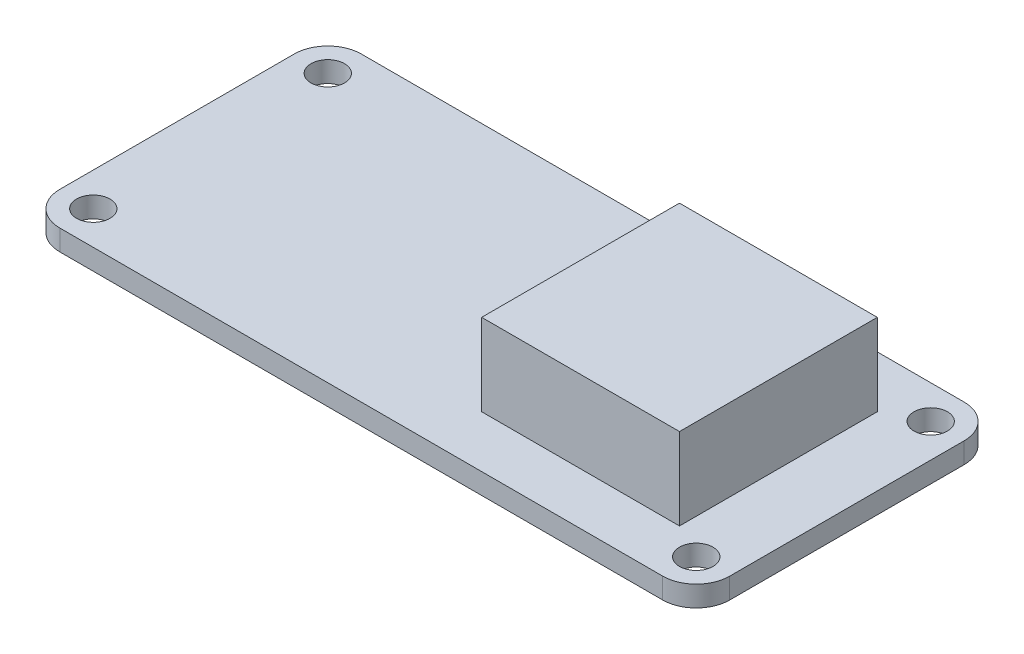
ISO-10303-21;
HEADER;
FILE_DESCRIPTION(('STEP AP214'),'2;1');
FILE_NAME('part.step','',(''),(''),'','','');
FILE_SCHEMA(('AUTOMOTIVE_DESIGN { 1 0 10303 214 1 1 1 1 }'));
ENDSEC;
DATA;
#1=APPLICATION_CONTEXT('core data for automotive mechanical design processes');
#2=APPLICATION_PROTOCOL_DEFINITION('international standard','automotive_design',2000,#1);
#3=PRODUCT_CONTEXT('',#1,'mechanical');
#4=PRODUCT('Part','Part','',(#3));
#5=PRODUCT_RELATED_PRODUCT_CATEGORY('part','',(#4));
#6=PRODUCT_DEFINITION_FORMATION('','',#4);
#7=PRODUCT_DEFINITION_CONTEXT('part definition',#1,'design');
#8=PRODUCT_DEFINITION('design','',#6,#7);
#9=PRODUCT_DEFINITION_SHAPE('','',#8);
#10=(LENGTH_UNIT() NAMED_UNIT(*) SI_UNIT(.MILLI.,.METRE.));
#11=(NAMED_UNIT(*) PLANE_ANGLE_UNIT() SI_UNIT($,.RADIAN.));
#12=(NAMED_UNIT(*) SI_UNIT($,.STERADIAN.) SOLID_ANGLE_UNIT());
#13=UNCERTAINTY_MEASURE_WITH_UNIT(LENGTH_MEASURE(1.E-05),#10,'distance_accuracy_value','');
#14=(GEOMETRIC_REPRESENTATION_CONTEXT(3) GLOBAL_UNCERTAINTY_ASSIGNED_CONTEXT((#13)) GLOBAL_UNIT_ASSIGNED_CONTEXT((#10,
#11,#12)) REPRESENTATION_CONTEXT('',''));
#15=CARTESIAN_POINT('',(0.,0.,0.));
#16=DIRECTION('',(0.,0.,1.));
#17=DIRECTION('',(1.,0.,0.));
#18=AXIS2_PLACEMENT_3D('',#15,#16,#17);
#19=CARTESIAN_POINT('',(0.,1.57,0.));
#20=DIRECTION('',(0.,-1.,0.));
#21=DIRECTION('',(0.,0.,-1.));
#22=AXIS2_PLACEMENT_3D('',#19,#20,#21);
#23=PLANE('',#22);
#24=DIRECTION('',(0.,0.,-1.));
#25=VECTOR('',#24,1.);
#26=CARTESIAN_POINT('',(25.4,1.57,11.43));
#27=LINE('',#26,#25);
#28=CARTESIAN_POINT('',(25.4,1.57,8.89));
#29=VERTEX_POINT('',#28);
#30=CARTESIAN_POINT('',(25.4,1.57,-8.89));
#31=VERTEX_POINT('',#30);
#32=EDGE_CURVE('E176',#29,#31,#27,.T.);
#33=ORIENTED_EDGE('',*,*,#32,.T.);
#34=CARTESIAN_POINT('',(22.86,1.57,-8.89));
#35=DIRECTION('',(0.,-1.,0.));
#36=DIRECTION('',(0.,0.,-1.));
#37=AXIS2_PLACEMENT_3D('',#34,#35,#36);
#38=CIRCLE('',#37,2.54);
#39=CARTESIAN_POINT('',(22.86,1.57,-11.43));
#40=VERTEX_POINT('',#39);
#41=EDGE_CURVE('E223',#31,#40,#38,.F.);
#42=ORIENTED_EDGE('',*,*,#41,.T.);
#43=DIRECTION('',(-1.,0.,0.));
#44=VECTOR('',#43,1.);
#45=CARTESIAN_POINT('',(-25.4,1.57,-11.43));
#46=LINE('',#45,#44);
#47=CARTESIAN_POINT('',(-22.86,1.57,-11.43));
#48=VERTEX_POINT('',#47);
#49=EDGE_CURVE('E179',#40,#48,#46,.T.);
#50=ORIENTED_EDGE('',*,*,#49,.T.);
#51=CARTESIAN_POINT('',(-22.86,1.57,-8.89));
#52=DIRECTION('',(0.,-1.,0.));
#53=DIRECTION('',(0.,0.,-1.));
#54=AXIS2_PLACEMENT_3D('',#51,#52,#53);
#55=CIRCLE('',#54,2.54);
#56=CARTESIAN_POINT('',(-25.4,1.57,-8.89));
#57=VERTEX_POINT('',#56);
#58=EDGE_CURVE('E217',#48,#57,#55,.F.);
#59=ORIENTED_EDGE('',*,*,#58,.T.);
#60=DIRECTION('',(0.,0.,1.));
#61=VECTOR('',#60,1.);
#62=CARTESIAN_POINT('',(-25.4,1.57,11.43));
#63=LINE('',#62,#61);
#64=CARTESIAN_POINT('',(-25.4,1.57,8.89));
#65=VERTEX_POINT('',#64);
#66=EDGE_CURVE('E183',#57,#65,#63,.T.);
#67=ORIENTED_EDGE('',*,*,#66,.T.);
#68=CARTESIAN_POINT('',(-22.86,1.57,8.89));
#69=DIRECTION('',(0.,-1.,0.));
#70=DIRECTION('',(0.,0.,-1.));
#71=AXIS2_PLACEMENT_3D('',#68,#69,#70);
#72=CIRCLE('',#71,2.54);
#73=CARTESIAN_POINT('',(-22.86,1.57,11.43));
#74=VERTEX_POINT('',#73);
#75=EDGE_CURVE('E219',#65,#74,#72,.F.);
#76=ORIENTED_EDGE('',*,*,#75,.T.);
#77=DIRECTION('',(1.,0.,0.));
#78=VECTOR('',#77,1.);
#79=CARTESIAN_POINT('',(-25.4,1.57,11.43));
#80=LINE('',#79,#78);
#81=CARTESIAN_POINT('',(22.86,1.57,11.43));
#82=VERTEX_POINT('',#81);
#83=EDGE_CURVE('E186',#74,#82,#80,.T.);
#84=ORIENTED_EDGE('',*,*,#83,.T.);
#85=CARTESIAN_POINT('',(22.86,1.57,8.89));
#86=DIRECTION('',(0.,-1.,0.));
#87=DIRECTION('',(0.,0.,-1.));
#88=AXIS2_PLACEMENT_3D('',#85,#86,#87);
#89=CIRCLE('',#88,2.54);
#90=EDGE_CURVE('E221',#82,#29,#89,.F.);
#91=ORIENTED_EDGE('',*,*,#90,.T.);
#92=EDGE_LOOP('',(#33,#42,#50,#59,#67,#76,#84,#91));
#93=FACE_BOUND('',#92,.T.);
#94=CARTESIAN_POINT('',(-22.86,1.57,8.89));
#95=DIRECTION('',(0.,1.,0.));
#96=DIRECTION('',(0.,0.,1.));
#97=AXIS2_PLACEMENT_3D('',#94,#95,#96);
#98=CIRCLE('',#97,1.26999999999999);
#99=CARTESIAN_POINT('',(-22.86,1.57,10.16));
#100=VERTEX_POINT('',#99);
#101=EDGE_CURVE('E169',#100,#100,#98,.T.);
#102=ORIENTED_EDGE('',*,*,#101,.F.);
#103=EDGE_LOOP('',(#102));
#104=FACE_BOUND('',#103,.T.);
#105=CARTESIAN_POINT('',(22.86,1.57,8.89));
#106=DIRECTION('',(0.,1.,0.));
#107=DIRECTION('',(0.,0.,1.));
#108=AXIS2_PLACEMENT_3D('',#105,#106,#107);
#109=CIRCLE('',#108,1.26999999999999);
#110=CARTESIAN_POINT('',(22.86,1.57,10.16));
#111=VERTEX_POINT('',#110);
#112=EDGE_CURVE('E163',#111,#111,#109,.T.);
#113=ORIENTED_EDGE('',*,*,#112,.F.);
#114=EDGE_LOOP('',(#113));
#115=FACE_BOUND('',#114,.T.);
#116=CARTESIAN_POINT('',(22.86,1.57,-8.89));
#117=DIRECTION('',(0.,1.,0.));
#118=DIRECTION('',(0.,0.,1.));
#119=AXIS2_PLACEMENT_3D('',#116,#117,#118);
#120=CIRCLE('',#119,1.26999999999999);
#121=CARTESIAN_POINT('',(22.86,1.57,-7.62000000000001));
#122=VERTEX_POINT('',#121);
#123=EDGE_CURVE('E157',#122,#122,#120,.T.);
#124=ORIENTED_EDGE('',*,*,#123,.F.);
#125=EDGE_LOOP('',(#124));
#126=FACE_BOUND('',#125,.T.);
#127=CARTESIAN_POINT('',(-22.86,1.57,-8.89));
#128=DIRECTION('',(0.,1.,0.));
#129=DIRECTION('',(0.,0.,1.));
#130=AXIS2_PLACEMENT_3D('',#127,#128,#129);
#131=CIRCLE('',#130,1.26999999999999);
#132=CARTESIAN_POINT('',(-22.86,1.57,-7.62000000000001));
#133=VERTEX_POINT('',#132);
#134=EDGE_CURVE('E146',#133,#133,#131,.T.);
#135=ORIENTED_EDGE('',*,*,#134,.F.);
#136=EDGE_LOOP('',(#135));
#137=FACE_BOUND('',#136,.T.);
#138=DIRECTION('',(0.,0.,-1.));
#139=VECTOR('',#138,1.);
#140=CARTESIAN_POINT('',(20.2,1.57,7.5));
#141=LINE('',#140,#139);
#142=CARTESIAN_POINT('',(20.2,1.57,7.5));
#143=VERTEX_POINT('',#142);
#144=CARTESIAN_POINT('',(20.2,1.57,-7.5));
#145=VERTEX_POINT('',#144);
#146=EDGE_CURVE('E145',#143,#145,#141,.T.);
#147=ORIENTED_EDGE('',*,*,#146,.F.);
#148=DIRECTION('',(1.,0.,0.));
#149=VECTOR('',#148,1.);
#150=CARTESIAN_POINT('',(5.20000000000001,1.57,7.5));
#151=LINE('',#150,#149);
#152=CARTESIAN_POINT('',(5.20000000000001,1.57,7.5));
#153=VERTEX_POINT('',#152);
#154=EDGE_CURVE('E142',#153,#143,#151,.T.);
#155=ORIENTED_EDGE('',*,*,#154,.F.);
#156=DIRECTION('',(0.,0.,1.));
#157=VECTOR('',#156,1.);
#158=CARTESIAN_POINT('',(5.20000000000001,1.57,7.5));
#159=LINE('',#158,#157);
#160=CARTESIAN_POINT('',(5.20000000000001,1.57,-7.5));
#161=VERTEX_POINT('',#160);
#162=EDGE_CURVE('E57',#161,#153,#159,.T.);
#163=ORIENTED_EDGE('',*,*,#162,.F.);
#164=DIRECTION('',(-1.,0.,0.));
#165=VECTOR('',#164,1.);
#166=CARTESIAN_POINT('',(5.20000000000001,1.57,-7.5));
#167=LINE('',#166,#165);
#168=EDGE_CURVE('E52',#145,#161,#167,.T.);
#169=ORIENTED_EDGE('',*,*,#168,.F.);
#170=EDGE_LOOP('',(#147,#155,#163,#169));
#171=FACE_BOUND('',#170,.T.);
#172=ADVANCED_FACE('F37',(#93,#104,#115,#126,#137,#171),#23,.F.);
#173=CARTESIAN_POINT('',(25.4,1.57,11.43));
#174=DIRECTION('',(-1.,0.,0.));
#175=DIRECTION('',(0.,0.,1.));
#176=AXIS2_PLACEMENT_3D('',#173,#174,#175);
#177=PLANE('',#176);
#178=DIRECTION('',(0.,0.,-1.));
#179=VECTOR('',#178,1.);
#180=CARTESIAN_POINT('',(25.4,0.,11.43));
#181=LINE('',#180,#179);
#182=CARTESIAN_POINT('',(25.4,0.,8.89));
#183=VERTEX_POINT('',#182);
#184=CARTESIAN_POINT('',(25.4,0.,-8.89));
#185=VERTEX_POINT('',#184);
#186=EDGE_CURVE('E175',#183,#185,#181,.T.);
#187=ORIENTED_EDGE('',*,*,#186,.T.);
#188=DIRECTION('',(0.,-1.,0.));
#189=VECTOR('',#188,1.);
#190=CARTESIAN_POINT('',(25.4,1.57,-8.89));
#191=LINE('',#190,#189);
#192=EDGE_CURVE('E215',#185,#31,#191,.F.);
#193=ORIENTED_EDGE('',*,*,#192,.T.);
#194=ORIENTED_EDGE('',*,*,#32,.F.);
#195=DIRECTION('',(0.,-1.,0.));
#196=VECTOR('',#195,1.);
#197=CARTESIAN_POINT('',(25.4,1.57,8.89));
#198=LINE('',#197,#196);
#199=EDGE_CURVE('E212',#29,#183,#198,.T.);
#200=ORIENTED_EDGE('',*,*,#199,.T.);
#201=EDGE_LOOP('',(#187,#193,#194,#200));
#202=FACE_BOUND('',#201,.T.);
#203=ADVANCED_FACE('F259',(#202),#177,.F.);
#204=CARTESIAN_POINT('',(-25.4,1.57,-11.43));
#205=DIRECTION('',(0.,0.,1.));
#206=DIRECTION('',(1.,0.,0.));
#207=AXIS2_PLACEMENT_3D('',#204,#205,#206);
#208=PLANE('',#207);
#209=ORIENTED_EDGE('',*,*,#49,.F.);
#210=DIRECTION('',(0.,-1.,0.));
#211=VECTOR('',#210,1.);
#212=CARTESIAN_POINT('',(22.86,1.57,-11.43));
#213=LINE('',#212,#211);
#214=CARTESIAN_POINT('',(22.86,0.,-11.43));
#215=VERTEX_POINT('',#214);
#216=EDGE_CURVE('E201',#40,#215,#213,.T.);
#217=ORIENTED_EDGE('',*,*,#216,.T.);
#218=DIRECTION('',(-1.,0.,0.));
#219=VECTOR('',#218,1.);
#220=CARTESIAN_POINT('',(-25.4,0.,-11.43));
#221=LINE('',#220,#219);
#222=CARTESIAN_POINT('',(-22.86,0.,-11.43));
#223=VERTEX_POINT('',#222);
#224=EDGE_CURVE('E192',#215,#223,#221,.T.);
#225=ORIENTED_EDGE('',*,*,#224,.T.);
#226=DIRECTION('',(0.,-1.,0.));
#227=VECTOR('',#226,1.);
#228=CARTESIAN_POINT('',(-22.86,1.57,-11.43));
#229=LINE('',#228,#227);
#230=EDGE_CURVE('E189',#223,#48,#229,.F.);
#231=ORIENTED_EDGE('',*,*,#230,.T.);
#232=EDGE_LOOP('',(#209,#217,#225,#231));
#233=FACE_BOUND('',#232,.T.);
#234=ADVANCED_FACE('F267',(#233),#208,.F.);
#235=CARTESIAN_POINT('',(-25.4,1.57,11.43));
#236=DIRECTION('',(1.,0.,0.));
#237=DIRECTION('',(0.,0.,-1.));
#238=AXIS2_PLACEMENT_3D('',#235,#236,#237);
#239=PLANE('',#238);
#240=DIRECTION('',(0.,0.,1.));
#241=VECTOR('',#240,1.);
#242=CARTESIAN_POINT('',(-25.4,0.,11.43));
#243=LINE('',#242,#241);
#244=CARTESIAN_POINT('',(-25.4,0.,-8.89));
#245=VERTEX_POINT('',#244);
#246=CARTESIAN_POINT('',(-25.4,0.,8.89));
#247=VERTEX_POINT('',#246);
#248=EDGE_CURVE('E195',#245,#247,#243,.T.);
#249=ORIENTED_EDGE('',*,*,#248,.T.);
#250=DIRECTION('',(0.,-1.,0.));
#251=VECTOR('',#250,1.);
#252=CARTESIAN_POINT('',(-25.4,1.57,8.89));
#253=LINE('',#252,#251);
#254=EDGE_CURVE('E11',#247,#65,#253,.F.);
#255=ORIENTED_EDGE('',*,*,#254,.T.);
#256=ORIENTED_EDGE('',*,*,#66,.F.);
#257=DIRECTION('',(0.,-1.,0.));
#258=VECTOR('',#257,1.);
#259=CARTESIAN_POINT('',(-25.4,1.57,-8.89));
#260=LINE('',#259,#258);
#261=EDGE_CURVE('E45',#57,#245,#260,.T.);
#262=ORIENTED_EDGE('',*,*,#261,.T.);
#263=EDGE_LOOP('',(#249,#255,#256,#262));
#264=FACE_BOUND('',#263,.T.);
#265=ADVANCED_FACE('F234',(#264),#239,.F.);
#266=CARTESIAN_POINT('',(-25.4,1.57,11.43));
#267=DIRECTION('',(0.,0.,-1.));
#268=DIRECTION('',(-1.,0.,0.));
#269=AXIS2_PLACEMENT_3D('',#266,#267,#268);
#270=PLANE('',#269);
#271=DIRECTION('',(1.,0.,0.));
#272=VECTOR('',#271,1.);
#273=CARTESIAN_POINT('',(-25.4,0.,11.43));
#274=LINE('',#273,#272);
#275=CARTESIAN_POINT('',(-22.86,0.,11.43));
#276=VERTEX_POINT('',#275);
#277=CARTESIAN_POINT('',(22.86,0.,11.43));
#278=VERTEX_POINT('',#277);
#279=EDGE_CURVE('E180',#276,#278,#274,.T.);
#280=ORIENTED_EDGE('',*,*,#279,.T.);
#281=DIRECTION('',(0.,-1.,0.));
#282=VECTOR('',#281,1.);
#283=CARTESIAN_POINT('',(22.86,1.57,11.43));
#284=LINE('',#283,#282);
#285=EDGE_CURVE('E228',#278,#82,#284,.F.);
#286=ORIENTED_EDGE('',*,*,#285,.T.);
#287=ORIENTED_EDGE('',*,*,#83,.F.);
#288=DIRECTION('',(0.,-1.,0.));
#289=VECTOR('',#288,1.);
#290=CARTESIAN_POINT('',(-22.86,1.57,11.43));
#291=LINE('',#290,#289);
#292=EDGE_CURVE('E225',#74,#276,#291,.T.);
#293=ORIENTED_EDGE('',*,*,#292,.T.);
#294=EDGE_LOOP('',(#280,#286,#287,#293));
#295=FACE_BOUND('',#294,.T.);
#296=ADVANCED_FACE('F248',(#295),#270,.F.);
#297=CARTESIAN_POINT('',(0.,0.,0.));
#298=DIRECTION('',(0.,-1.,0.));
#299=DIRECTION('',(0.,0.,-1.));
#300=AXIS2_PLACEMENT_3D('',#297,#298,#299);
#301=PLANE('',#300);
#302=CARTESIAN_POINT('',(-22.86,0.,-8.89));
#303=DIRECTION('',(0.,1.,0.));
#304=DIRECTION('',(0.,0.,1.));
#305=AXIS2_PLACEMENT_3D('',#302,#303,#304);
#306=CIRCLE('',#305,1.27);
#307=CARTESIAN_POINT('',(-22.86,0.,-7.62));
#308=VERTEX_POINT('',#307);
#309=EDGE_CURVE('E149',#308,#308,#306,.T.);
#310=ORIENTED_EDGE('',*,*,#309,.T.);
#311=EDGE_LOOP('',(#310));
#312=FACE_BOUND('',#311,.T.);
#313=CARTESIAN_POINT('',(22.86,0.,-8.89));
#314=DIRECTION('',(0.,1.,0.));
#315=DIRECTION('',(0.,0.,1.));
#316=AXIS2_PLACEMENT_3D('',#313,#314,#315);
#317=CIRCLE('',#316,1.27);
#318=CARTESIAN_POINT('',(22.86,0.,-7.62));
#319=VERTEX_POINT('',#318);
#320=EDGE_CURVE('E160',#319,#319,#317,.T.);
#321=ORIENTED_EDGE('',*,*,#320,.T.);
#322=EDGE_LOOP('',(#321));
#323=FACE_BOUND('',#322,.T.);
#324=CARTESIAN_POINT('',(22.86,0.,8.89));
#325=DIRECTION('',(0.,1.,0.));
#326=DIRECTION('',(0.,0.,1.));
#327=AXIS2_PLACEMENT_3D('',#324,#325,#326);
#328=CIRCLE('',#327,1.27);
#329=CARTESIAN_POINT('',(22.86,0.,10.16));
#330=VERTEX_POINT('',#329);
#331=EDGE_CURVE('E166',#330,#330,#328,.T.);
#332=ORIENTED_EDGE('',*,*,#331,.T.);
#333=EDGE_LOOP('',(#332));
#334=FACE_BOUND('',#333,.T.);
#335=CARTESIAN_POINT('',(-22.86,0.,8.89));
#336=DIRECTION('',(0.,1.,0.));
#337=DIRECTION('',(0.,0.,1.));
#338=AXIS2_PLACEMENT_3D('',#335,#336,#337);
#339=CIRCLE('',#338,1.27);
#340=CARTESIAN_POINT('',(-22.86,0.,10.16));
#341=VERTEX_POINT('',#340);
#342=EDGE_CURVE('E172',#341,#341,#339,.T.);
#343=ORIENTED_EDGE('',*,*,#342,.T.);
#344=EDGE_LOOP('',(#343));
#345=FACE_BOUND('',#344,.T.);
#346=ORIENTED_EDGE('',*,*,#224,.F.);
#347=CARTESIAN_POINT('',(22.86,0.,-8.89));
#348=DIRECTION('',(0.,-1.,0.));
#349=DIRECTION('',(0.,0.,-1.));
#350=AXIS2_PLACEMENT_3D('',#347,#348,#349);
#351=CIRCLE('',#350,2.54);
#352=EDGE_CURVE('E210',#215,#185,#351,.T.);
#353=ORIENTED_EDGE('',*,*,#352,.T.);
#354=ORIENTED_EDGE('',*,*,#186,.F.);
#355=CARTESIAN_POINT('',(22.86,0.,8.89));
#356=DIRECTION('',(0.,-1.,0.));
#357=DIRECTION('',(0.,0.,-1.));
#358=AXIS2_PLACEMENT_3D('',#355,#356,#357);
#359=CIRCLE('',#358,2.54);
#360=EDGE_CURVE('E208',#183,#278,#359,.T.);
#361=ORIENTED_EDGE('',*,*,#360,.T.);
#362=ORIENTED_EDGE('',*,*,#279,.F.);
#363=CARTESIAN_POINT('',(-22.86,0.,8.89));
#364=DIRECTION('',(0.,-1.,0.));
#365=DIRECTION('',(0.,0.,-1.));
#366=AXIS2_PLACEMENT_3D('',#363,#364,#365);
#367=CIRCLE('',#366,2.54);
#368=EDGE_CURVE('E206',#276,#247,#367,.T.);
#369=ORIENTED_EDGE('',*,*,#368,.T.);
#370=ORIENTED_EDGE('',*,*,#248,.F.);
#371=CARTESIAN_POINT('',(-22.86,0.,-8.89));
#372=DIRECTION('',(0.,-1.,0.));
#373=DIRECTION('',(0.,0.,-1.));
#374=AXIS2_PLACEMENT_3D('',#371,#372,#373);
#375=CIRCLE('',#374,2.54);
#376=EDGE_CURVE('E204',#245,#223,#375,.T.);
#377=ORIENTED_EDGE('',*,*,#376,.T.);
#378=EDGE_LOOP('',(#346,#353,#354,#361,#362,#369,#370,#377));
#379=FACE_BOUND('',#378,.T.);
#380=ADVANCED_FACE('F240',(#312,#323,#334,#345,#379),#301,.T.);
#381=CARTESIAN_POINT('',(-22.86,1.57,8.89));
#382=DIRECTION('',(0.,1.,0.));
#383=DIRECTION('',(0.,0.,1.));
#384=AXIS2_PLACEMENT_3D('',#381,#382,#383);
#385=CYLINDRICAL_SURFACE('',#384,1.26999999999999);
#386=ORIENTED_EDGE('',*,*,#342,.F.);
#387=EDGE_LOOP('',(#386));
#388=FACE_BOUND('',#387,.T.);
#389=ORIENTED_EDGE('',*,*,#101,.T.);
#390=EDGE_LOOP('',(#389));
#391=FACE_BOUND('',#390,.T.);
#392=ADVANCED_FACE('F283',(#388,#391),#385,.F.);
#393=CARTESIAN_POINT('',(22.86,1.57,8.89));
#394=DIRECTION('',(0.,1.,0.));
#395=DIRECTION('',(0.,0.,1.));
#396=AXIS2_PLACEMENT_3D('',#393,#394,#395);
#397=CYLINDRICAL_SURFACE('',#396,1.26999999999999);
#398=ORIENTED_EDGE('',*,*,#331,.F.);
#399=EDGE_LOOP('',(#398));
#400=FACE_BOUND('',#399,.T.);
#401=ORIENTED_EDGE('',*,*,#112,.T.);
#402=EDGE_LOOP('',(#401));
#403=FACE_BOUND('',#402,.T.);
#404=ADVANCED_FACE('F366',(#400,#403),#397,.F.);
#405=CARTESIAN_POINT('',(22.86,1.57,-8.89));
#406=DIRECTION('',(0.,1.,0.));
#407=DIRECTION('',(0.,0.,1.));
#408=AXIS2_PLACEMENT_3D('',#405,#406,#407);
#409=CYLINDRICAL_SURFACE('',#408,1.26999999999999);
#410=ORIENTED_EDGE('',*,*,#320,.F.);
#411=EDGE_LOOP('',(#410));
#412=FACE_BOUND('',#411,.T.);
#413=ORIENTED_EDGE('',*,*,#123,.T.);
#414=EDGE_LOOP('',(#413));
#415=FACE_BOUND('',#414,.T.);
#416=ADVANCED_FACE('F363',(#412,#415),#409,.F.);
#417=CARTESIAN_POINT('',(-22.86,1.57,-8.89));
#418=DIRECTION('',(0.,1.,0.));
#419=DIRECTION('',(0.,0.,1.));
#420=AXIS2_PLACEMENT_3D('',#417,#418,#419);
#421=CYLINDRICAL_SURFACE('',#420,1.26999999999999);
#422=ORIENTED_EDGE('',*,*,#309,.F.);
#423=EDGE_LOOP('',(#422));
#424=FACE_BOUND('',#423,.T.);
#425=ORIENTED_EDGE('',*,*,#134,.T.);
#426=EDGE_LOOP('',(#425));
#427=FACE_BOUND('',#426,.T.);
#428=ADVANCED_FACE('F296',(#424,#427),#421,.F.);
#429=CARTESIAN_POINT('',(22.86,1.57,-8.89));
#430=DIRECTION('',(0.,-1.,0.));
#431=DIRECTION('',(0.,0.,-1.));
#432=AXIS2_PLACEMENT_3D('',#429,#430,#431);
#433=CYLINDRICAL_SURFACE('',#432,2.54);
#434=ORIENTED_EDGE('',*,*,#41,.F.);
#435=ORIENTED_EDGE('',*,*,#192,.F.);
#436=ORIENTED_EDGE('',*,*,#352,.F.);
#437=ORIENTED_EDGE('',*,*,#216,.F.);
#438=EDGE_LOOP('',(#434,#435,#436,#437));
#439=FACE_BOUND('',#438,.T.);
#440=ADVANCED_FACE('F264',(#439),#433,.T.);
#441=CARTESIAN_POINT('',(22.86,1.57,8.89));
#442=DIRECTION('',(0.,-1.,0.));
#443=DIRECTION('',(0.,0.,-1.));
#444=AXIS2_PLACEMENT_3D('',#441,#442,#443);
#445=CYLINDRICAL_SURFACE('',#444,2.54);
#446=ORIENTED_EDGE('',*,*,#90,.F.);
#447=ORIENTED_EDGE('',*,*,#285,.F.);
#448=ORIENTED_EDGE('',*,*,#360,.F.);
#449=ORIENTED_EDGE('',*,*,#199,.F.);
#450=EDGE_LOOP('',(#446,#447,#448,#449));
#451=FACE_BOUND('',#450,.T.);
#452=ADVANCED_FACE('F256',(#451),#445,.T.);
#453=CARTESIAN_POINT('',(-22.86,1.57,8.89));
#454=DIRECTION('',(0.,-1.,0.));
#455=DIRECTION('',(0.,0.,-1.));
#456=AXIS2_PLACEMENT_3D('',#453,#454,#455);
#457=CYLINDRICAL_SURFACE('',#456,2.54);
#458=ORIENTED_EDGE('',*,*,#75,.F.);
#459=ORIENTED_EDGE('',*,*,#254,.F.);
#460=ORIENTED_EDGE('',*,*,#368,.F.);
#461=ORIENTED_EDGE('',*,*,#292,.F.);
#462=EDGE_LOOP('',(#458,#459,#460,#461));
#463=FACE_BOUND('',#462,.T.);
#464=ADVANCED_FACE('F245',(#463),#457,.T.);
#465=CARTESIAN_POINT('',(-22.86,1.57,-8.89));
#466=DIRECTION('',(0.,-1.,0.));
#467=DIRECTION('',(0.,0.,-1.));
#468=AXIS2_PLACEMENT_3D('',#465,#466,#467);
#469=CYLINDRICAL_SURFACE('',#468,2.54);
#470=ORIENTED_EDGE('',*,*,#58,.F.);
#471=ORIENTED_EDGE('',*,*,#230,.F.);
#472=ORIENTED_EDGE('',*,*,#376,.F.);
#473=ORIENTED_EDGE('',*,*,#261,.F.);
#474=EDGE_LOOP('',(#470,#471,#472,#473));
#475=FACE_BOUND('',#474,.T.);
#476=ADVANCED_FACE('F39',(#475),#469,.T.);
#477=CARTESIAN_POINT('',(20.2,7.77,7.5));
#478=DIRECTION('',(-1.,0.,0.));
#479=DIRECTION('',(0.,0.,1.));
#480=AXIS2_PLACEMENT_3D('',#477,#478,#479);
#481=PLANE('',#480);
#482=ORIENTED_EDGE('',*,*,#146,.T.);
#483=DIRECTION('',(0.,-1.,0.));
#484=VECTOR('',#483,1.);
#485=CARTESIAN_POINT('',(20.2,7.77,-7.5));
#486=LINE('',#485,#484);
#487=CARTESIAN_POINT('',(20.2,7.77,-7.5));
#488=VERTEX_POINT('',#487);
#489=EDGE_CURVE('E126',#488,#145,#486,.T.);
#490=ORIENTED_EDGE('',*,*,#489,.F.);
#491=DIRECTION('',(0.,0.,-1.));
#492=VECTOR('',#491,1.);
#493=CARTESIAN_POINT('',(20.2,7.77,7.5));
#494=LINE('',#493,#492);
#495=CARTESIAN_POINT('',(20.2,7.77,7.5));
#496=VERTEX_POINT('',#495);
#497=EDGE_CURVE('E133',#496,#488,#494,.T.);
#498=ORIENTED_EDGE('',*,*,#497,.F.);
#499=DIRECTION('',(0.,-1.,0.));
#500=VECTOR('',#499,1.);
#501=CARTESIAN_POINT('',(20.2,7.77,7.5));
#502=LINE('',#501,#500);
#503=EDGE_CURVE('E385',#496,#143,#502,.T.);
#504=ORIENTED_EDGE('',*,*,#503,.T.);
#505=EDGE_LOOP('',(#482,#490,#498,#504));
#506=FACE_BOUND('',#505,.T.);
#507=ADVANCED_FACE('F144',(#506),#481,.F.);
#508=CARTESIAN_POINT('',(5.20000000000001,7.77,-7.5));
#509=DIRECTION('',(0.,0.,1.));
#510=DIRECTION('',(1.,0.,0.));
#511=AXIS2_PLACEMENT_3D('',#508,#509,#510);
#512=PLANE('',#511);
#513=ORIENTED_EDGE('',*,*,#168,.T.);
#514=DIRECTION('',(0.,-1.,0.));
#515=VECTOR('',#514,1.);
#516=CARTESIAN_POINT('',(5.20000000000001,7.77,-7.5));
#517=LINE('',#516,#515);
#518=CARTESIAN_POINT('',(5.20000000000001,7.77,-7.5));
#519=VERTEX_POINT('',#518);
#520=EDGE_CURVE('E129',#519,#161,#517,.T.);
#521=ORIENTED_EDGE('',*,*,#520,.F.);
#522=DIRECTION('',(-1.,0.,0.));
#523=VECTOR('',#522,1.);
#524=CARTESIAN_POINT('',(5.20000000000001,7.77,-7.5));
#525=LINE('',#524,#523);
#526=EDGE_CURVE('E122',#488,#519,#525,.T.);
#527=ORIENTED_EDGE('',*,*,#526,.F.);
#528=ORIENTED_EDGE('',*,*,#489,.T.);
#529=EDGE_LOOP('',(#513,#521,#527,#528));
#530=FACE_BOUND('',#529,.T.);
#531=ADVANCED_FACE('F124',(#530),#512,.F.);
#532=CARTESIAN_POINT('',(5.20000000000001,7.77,7.5));
#533=DIRECTION('',(1.,0.,0.));
#534=DIRECTION('',(0.,0.,-1.));
#535=AXIS2_PLACEMENT_3D('',#532,#533,#534);
#536=PLANE('',#535);
#537=ORIENTED_EDGE('',*,*,#162,.T.);
#538=DIRECTION('',(0.,-1.,0.));
#539=VECTOR('',#538,1.);
#540=CARTESIAN_POINT('',(5.20000000000001,7.77,7.5));
#541=LINE('',#540,#539);
#542=CARTESIAN_POINT('',(5.20000000000001,7.77,7.5));
#543=VERTEX_POINT('',#542);
#544=EDGE_CURVE('E151',#543,#153,#541,.T.);
#545=ORIENTED_EDGE('',*,*,#544,.F.);
#546=DIRECTION('',(0.,0.,1.));
#547=VECTOR('',#546,1.);
#548=CARTESIAN_POINT('',(5.20000000000001,7.77,7.5));
#549=LINE('',#548,#547);
#550=EDGE_CURVE('E132',#519,#543,#549,.T.);
#551=ORIENTED_EDGE('',*,*,#550,.F.);
#552=ORIENTED_EDGE('',*,*,#520,.T.);
#553=EDGE_LOOP('',(#537,#545,#551,#552));
#554=FACE_BOUND('',#553,.T.);
#555=ADVANCED_FACE('F330',(#554),#536,.F.);
#556=CARTESIAN_POINT('',(5.20000000000001,7.77,7.5));
#557=DIRECTION('',(0.,0.,-1.));
#558=DIRECTION('',(-1.,0.,0.));
#559=AXIS2_PLACEMENT_3D('',#556,#557,#558);
#560=PLANE('',#559);
#561=ORIENTED_EDGE('',*,*,#154,.T.);
#562=ORIENTED_EDGE('',*,*,#503,.F.);
#563=DIRECTION('',(1.,0.,0.));
#564=VECTOR('',#563,1.);
#565=CARTESIAN_POINT('',(5.20000000000001,7.77,7.5));
#566=LINE('',#565,#564);
#567=EDGE_CURVE('E138',#543,#496,#566,.T.);
#568=ORIENTED_EDGE('',*,*,#567,.F.);
#569=ORIENTED_EDGE('',*,*,#544,.T.);
#570=EDGE_LOOP('',(#561,#562,#568,#569));
#571=FACE_BOUND('',#570,.T.);
#572=ADVANCED_FACE('F339',(#571),#560,.F.);
#573=CARTESIAN_POINT('',(0.,7.77,0.));
#574=DIRECTION('',(0.,-1.,0.));
#575=DIRECTION('',(0.,0.,-1.));
#576=AXIS2_PLACEMENT_3D('',#573,#574,#575);
#577=PLANE('',#576);
#578=ORIENTED_EDGE('',*,*,#497,.T.);
#579=ORIENTED_EDGE('',*,*,#526,.T.);
#580=ORIENTED_EDGE('',*,*,#550,.T.);
#581=ORIENTED_EDGE('',*,*,#567,.T.);
#582=EDGE_LOOP('',(#578,#579,#580,#581));
#583=FACE_BOUND('',#582,.T.);
#584=ADVANCED_FACE('F136',(#583),#577,.F.);
#585=CLOSED_SHELL('',(#172,#203,#234,#265,#296,#380,#392,#404,#416,#428,#440,#452,#464,#476,
#507,#531,#555,#572,#584));
#586=MANIFOLD_SOLID_BREP('B2',#585);
#587=ADVANCED_BREP_SHAPE_REPRESENTATION('',(#18,#586),#14);
#588=SHAPE_DEFINITION_REPRESENTATION(#9,#587);
ENDSEC;
END-ISO-10303-21;
